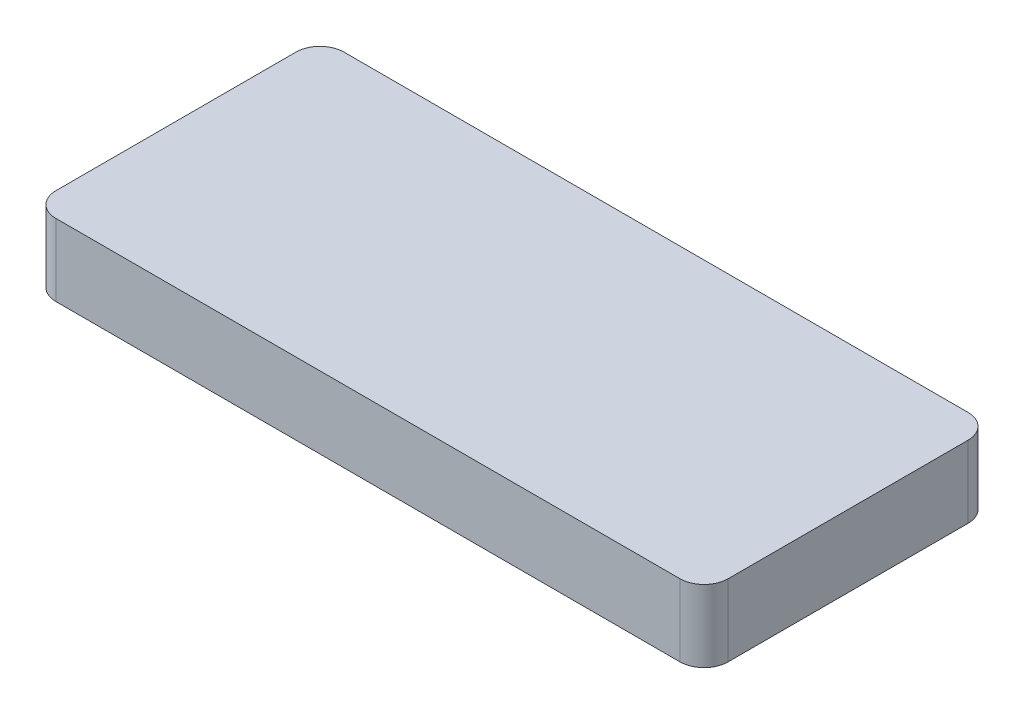
ISO-10303-21;
HEADER;
FILE_DESCRIPTION(('STEP AP214'),'2;1');
FILE_NAME('part.step','',(''),(''),'','','');
FILE_SCHEMA(('AUTOMOTIVE_DESIGN { 1 0 10303 214 1 1 1 1 }'));
ENDSEC;
DATA;
#1=APPLICATION_CONTEXT('core data for automotive mechanical design processes');
#2=APPLICATION_PROTOCOL_DEFINITION('international standard','automotive_design',2000,#1);
#3=PRODUCT_CONTEXT('',#1,'mechanical');
#4=PRODUCT('Part','Part','',(#3));
#5=PRODUCT_RELATED_PRODUCT_CATEGORY('part','',(#4));
#6=PRODUCT_DEFINITION_FORMATION('','',#4);
#7=PRODUCT_DEFINITION_CONTEXT('part definition',#1,'design');
#8=PRODUCT_DEFINITION('design','',#6,#7);
#9=PRODUCT_DEFINITION_SHAPE('','',#8);
#10=(LENGTH_UNIT() NAMED_UNIT(*) SI_UNIT(.MILLI.,.METRE.));
#11=(NAMED_UNIT(*) PLANE_ANGLE_UNIT() SI_UNIT($,.RADIAN.));
#12=(NAMED_UNIT(*) SI_UNIT($,.STERADIAN.) SOLID_ANGLE_UNIT());
#13=UNCERTAINTY_MEASURE_WITH_UNIT(LENGTH_MEASURE(1.E-05),#10,'distance_accuracy_value','');
#14=(GEOMETRIC_REPRESENTATION_CONTEXT(3) GLOBAL_UNCERTAINTY_ASSIGNED_CONTEXT((#13)) GLOBAL_UNIT_ASSIGNED_CONTEXT((#10,
#11,#12)) REPRESENTATION_CONTEXT('',''));
#15=CARTESIAN_POINT('',(0.,0.,0.));
#16=DIRECTION('',(0.,0.,1.));
#17=DIRECTION('',(1.,0.,0.));
#18=AXIS2_PLACEMENT_3D('',#15,#16,#17);
#19=CARTESIAN_POINT('',(70.,15.,30.));
#20=DIRECTION('',(-1.,0.,0.));
#21=DIRECTION('',(0.,0.,1.));
#22=AXIS2_PLACEMENT_3D('',#19,#20,#21);
#23=PLANE('',#22);
#24=DIRECTION('',(0.,0.,-1.));
#25=VECTOR('',#24,1.);
#26=CARTESIAN_POINT('',(70.,0.,30.));
#27=LINE('',#26,#25);
#28=CARTESIAN_POINT('',(70.,0.,25.));
#29=VERTEX_POINT('',#28);
#30=CARTESIAN_POINT('',(70.,0.,-25.));
#31=VERTEX_POINT('',#30);
#32=EDGE_CURVE('E132',#29,#31,#27,.T.);
#33=ORIENTED_EDGE('',*,*,#32,.T.);
#34=DIRECTION('',(0.,-1.,0.));
#35=VECTOR('',#34,1.);
#36=CARTESIAN_POINT('',(70.,15.,-25.));
#37=LINE('',#36,#35);
#38=CARTESIAN_POINT('',(70.,15.,-25.));
#39=VERTEX_POINT('',#38);
#40=EDGE_CURVE('E110',#31,#39,#37,.F.);
#41=ORIENTED_EDGE('',*,*,#40,.T.);
#42=DIRECTION('',(0.,0.,-1.));
#43=VECTOR('',#42,1.);
#44=CARTESIAN_POINT('',(70.,15.,30.));
#45=LINE('',#44,#43);
#46=CARTESIAN_POINT('',(70.,15.,25.));
#47=VERTEX_POINT('',#46);
#48=EDGE_CURVE('E141',#47,#39,#45,.T.);
#49=ORIENTED_EDGE('',*,*,#48,.F.);
#50=DIRECTION('',(0.,-1.,0.));
#51=VECTOR('',#50,1.);
#52=CARTESIAN_POINT('',(70.,15.,25.));
#53=LINE('',#52,#51);
#54=EDGE_CURVE('E115',#47,#29,#53,.T.);
#55=ORIENTED_EDGE('',*,*,#54,.T.);
#56=EDGE_LOOP('',(#33,#41,#49,#55));
#57=FACE_BOUND('',#56,.T.);
#58=ADVANCED_FACE('F39',(#57),#23,.F.);
#59=CARTESIAN_POINT('',(-70.,15.,-30.));
#60=DIRECTION('',(0.,0.,1.));
#61=DIRECTION('',(1.,0.,0.));
#62=AXIS2_PLACEMENT_3D('',#59,#60,#61);
#63=PLANE('',#62);
#64=DIRECTION('',(-1.,0.,0.));
#65=VECTOR('',#64,1.);
#66=CARTESIAN_POINT('',(-70.,15.,-30.));
#67=LINE('',#66,#65);
#68=CARTESIAN_POINT('',(65.,15.,-30.));
#69=VERTEX_POINT('',#68);
#70=CARTESIAN_POINT('',(-65.,15.,-30.));
#71=VERTEX_POINT('',#70);
#72=EDGE_CURVE('E125',#69,#71,#67,.T.);
#73=ORIENTED_EDGE('',*,*,#72,.F.);
#74=DIRECTION('',(0.,-1.,0.));
#75=VECTOR('',#74,1.);
#76=CARTESIAN_POINT('',(65.,15.,-30.));
#77=LINE('',#76,#75);
#78=CARTESIAN_POINT('',(65.,0.,-30.));
#79=VERTEX_POINT('',#78);
#80=EDGE_CURVE('E109',#69,#79,#77,.T.);
#81=ORIENTED_EDGE('',*,*,#80,.T.);
#82=DIRECTION('',(-1.,0.,0.));
#83=VECTOR('',#82,1.);
#84=CARTESIAN_POINT('',(-70.,0.,-30.));
#85=LINE('',#84,#83);
#86=CARTESIAN_POINT('',(-65.,0.,-30.));
#87=VERTEX_POINT('',#86);
#88=EDGE_CURVE('E122',#79,#87,#85,.T.);
#89=ORIENTED_EDGE('',*,*,#88,.T.);
#90=DIRECTION('',(0.,-1.,0.));
#91=VECTOR('',#90,1.);
#92=CARTESIAN_POINT('',(-65.,15.,-30.));
#93=LINE('',#92,#91);
#94=EDGE_CURVE('E127',#87,#71,#93,.F.);
#95=ORIENTED_EDGE('',*,*,#94,.T.);
#96=EDGE_LOOP('',(#73,#81,#89,#95));
#97=FACE_BOUND('',#96,.T.);
#98=ADVANCED_FACE('F121',(#97),#63,.F.);
#99=CARTESIAN_POINT('',(-70.,15.,30.));
#100=DIRECTION('',(1.,0.,0.));
#101=DIRECTION('',(0.,0.,-1.));
#102=AXIS2_PLACEMENT_3D('',#99,#100,#101);
#103=PLANE('',#102);
#104=DIRECTION('',(0.,0.,1.));
#105=VECTOR('',#104,1.);
#106=CARTESIAN_POINT('',(-70.,0.,30.));
#107=LINE('',#106,#105);
#108=CARTESIAN_POINT('',(-70.,0.,-25.));
#109=VERTEX_POINT('',#108);
#110=CARTESIAN_POINT('',(-70.,0.,25.));
#111=VERTEX_POINT('',#110);
#112=EDGE_CURVE('E131',#109,#111,#107,.T.);
#113=ORIENTED_EDGE('',*,*,#112,.T.);
#114=DIRECTION('',(0.,-1.,0.));
#115=VECTOR('',#114,1.);
#116=CARTESIAN_POINT('',(-70.,15.,25.));
#117=LINE('',#116,#115);
#118=CARTESIAN_POINT('',(-70.,15.,25.));
#119=VERTEX_POINT('',#118);
#120=EDGE_CURVE('E11',#111,#119,#117,.F.);
#121=ORIENTED_EDGE('',*,*,#120,.T.);
#122=DIRECTION('',(0.,0.,1.));
#123=VECTOR('',#122,1.);
#124=CARTESIAN_POINT('',(-70.,15.,30.));
#125=LINE('',#124,#123);
#126=CARTESIAN_POINT('',(-70.,15.,-25.));
#127=VERTEX_POINT('',#126);
#128=EDGE_CURVE('E167',#127,#119,#125,.T.);
#129=ORIENTED_EDGE('',*,*,#128,.F.);
#130=DIRECTION('',(0.,-1.,0.));
#131=VECTOR('',#130,1.);
#132=CARTESIAN_POINT('',(-70.,15.,-25.));
#133=LINE('',#132,#131);
#134=EDGE_CURVE('E47',#127,#109,#133,.T.);
#135=ORIENTED_EDGE('',*,*,#134,.T.);
#136=EDGE_LOOP('',(#113,#121,#129,#135));
#137=FACE_BOUND('',#136,.T.);
#138=ADVANCED_FACE('F165',(#137),#103,.F.);
#139=CARTESIAN_POINT('',(-70.,15.,30.));
#140=DIRECTION('',(0.,0.,-1.));
#141=DIRECTION('',(-1.,0.,0.));
#142=AXIS2_PLACEMENT_3D('',#139,#140,#141);
#143=PLANE('',#142);
#144=DIRECTION('',(1.,0.,0.));
#145=VECTOR('',#144,1.);
#146=CARTESIAN_POINT('',(-70.,0.,30.));
#147=LINE('',#146,#145);
#148=CARTESIAN_POINT('',(-65.,0.,30.));
#149=VERTEX_POINT('',#148);
#150=CARTESIAN_POINT('',(65.,0.,30.));
#151=VERTEX_POINT('',#150);
#152=EDGE_CURVE('E135',#149,#151,#147,.T.);
#153=ORIENTED_EDGE('',*,*,#152,.T.);
#154=DIRECTION('',(0.,-1.,0.));
#155=VECTOR('',#154,1.);
#156=CARTESIAN_POINT('',(65.,15.,30.));
#157=LINE('',#156,#155);
#158=CARTESIAN_POINT('',(65.,15.,30.));
#159=VERTEX_POINT('',#158);
#160=EDGE_CURVE('E54',#151,#159,#157,.F.);
#161=ORIENTED_EDGE('',*,*,#160,.T.);
#162=DIRECTION('',(1.,0.,0.));
#163=VECTOR('',#162,1.);
#164=CARTESIAN_POINT('',(-70.,15.,30.));
#165=LINE('',#164,#163);
#166=CARTESIAN_POINT('',(-65.,15.,30.));
#167=VERTEX_POINT('',#166);
#168=EDGE_CURVE('E142',#167,#159,#165,.T.);
#169=ORIENTED_EDGE('',*,*,#168,.F.);
#170=DIRECTION('',(0.,-1.,0.));
#171=VECTOR('',#170,1.);
#172=CARTESIAN_POINT('',(-65.,15.,30.));
#173=LINE('',#172,#171);
#174=EDGE_CURVE('E158',#167,#149,#173,.T.);
#175=ORIENTED_EDGE('',*,*,#174,.T.);
#176=EDGE_LOOP('',(#153,#161,#169,#175));
#177=FACE_BOUND('',#176,.T.);
#178=ADVANCED_FACE('F174',(#177),#143,.F.);
#179=CARTESIAN_POINT('',(0.,15.,0.));
#180=DIRECTION('',(0.,-1.,0.));
#181=DIRECTION('',(0.,0.,-1.));
#182=AXIS2_PLACEMENT_3D('',#179,#180,#181);
#183=PLANE('',#182);
#184=ORIENTED_EDGE('',*,*,#48,.T.);
#185=CARTESIAN_POINT('',(65.,15.,-25.));
#186=DIRECTION('',(0.,-1.,0.));
#187=DIRECTION('',(0.,0.,-1.));
#188=AXIS2_PLACEMENT_3D('',#185,#186,#187);
#189=CIRCLE('',#188,5.);
#190=EDGE_CURVE('E156',#39,#69,#189,.F.);
#191=ORIENTED_EDGE('',*,*,#190,.T.);
#192=ORIENTED_EDGE('',*,*,#72,.T.);
#193=CARTESIAN_POINT('',(-65.,15.,-25.));
#194=DIRECTION('',(0.,-1.,0.));
#195=DIRECTION('',(0.,0.,-1.));
#196=AXIS2_PLACEMENT_3D('',#193,#194,#195);
#197=CIRCLE('',#196,5.);
#198=EDGE_CURVE('E151',#71,#127,#197,.F.);
#199=ORIENTED_EDGE('',*,*,#198,.T.);
#200=ORIENTED_EDGE('',*,*,#128,.T.);
#201=CARTESIAN_POINT('',(-65.,15.,25.));
#202=DIRECTION('',(0.,-1.,0.));
#203=DIRECTION('',(0.,0.,-1.));
#204=AXIS2_PLACEMENT_3D('',#201,#202,#203);
#205=CIRCLE('',#204,5.);
#206=EDGE_CURVE('E61',#119,#167,#205,.F.);
#207=ORIENTED_EDGE('',*,*,#206,.T.);
#208=ORIENTED_EDGE('',*,*,#168,.T.);
#209=CARTESIAN_POINT('',(65.,15.,25.));
#210=DIRECTION('',(0.,-1.,0.));
#211=DIRECTION('',(0.,0.,-1.));
#212=AXIS2_PLACEMENT_3D('',#209,#210,#211);
#213=CIRCLE('',#212,5.);
#214=EDGE_CURVE('E154',#159,#47,#213,.F.);
#215=ORIENTED_EDGE('',*,*,#214,.T.);
#216=EDGE_LOOP('',(#184,#191,#192,#199,#200,#207,#208,#215));
#217=FACE_BOUND('',#216,.T.);
#218=ADVANCED_FACE('F181',(#217),#183,.F.);
#219=CARTESIAN_POINT('',(0.,0.,0.));
#220=DIRECTION('',(0.,-1.,0.));
#221=DIRECTION('',(0.,0.,-1.));
#222=AXIS2_PLACEMENT_3D('',#219,#220,#221);
#223=PLANE('',#222);
#224=ORIENTED_EDGE('',*,*,#88,.F.);
#225=CARTESIAN_POINT('',(65.,0.,-25.));
#226=DIRECTION('',(0.,-1.,0.));
#227=DIRECTION('',(0.,0.,-1.));
#228=AXIS2_PLACEMENT_3D('',#225,#226,#227);
#229=CIRCLE('',#228,5.);
#230=EDGE_CURVE('E105',#79,#31,#229,.T.);
#231=ORIENTED_EDGE('',*,*,#230,.T.);
#232=ORIENTED_EDGE('',*,*,#32,.F.);
#233=CARTESIAN_POINT('',(65.,0.,25.));
#234=DIRECTION('',(0.,-1.,0.));
#235=DIRECTION('',(0.,0.,-1.));
#236=AXIS2_PLACEMENT_3D('',#233,#234,#235);
#237=CIRCLE('',#236,5.);
#238=EDGE_CURVE('E116',#29,#151,#237,.T.);
#239=ORIENTED_EDGE('',*,*,#238,.T.);
#240=ORIENTED_EDGE('',*,*,#152,.F.);
#241=CARTESIAN_POINT('',(-65.,0.,25.));
#242=DIRECTION('',(0.,-1.,0.));
#243=DIRECTION('',(0.,0.,-1.));
#244=AXIS2_PLACEMENT_3D('',#241,#242,#243);
#245=CIRCLE('',#244,5.);
#246=EDGE_CURVE('E145',#149,#111,#245,.T.);
#247=ORIENTED_EDGE('',*,*,#246,.T.);
#248=ORIENTED_EDGE('',*,*,#112,.F.);
#249=CARTESIAN_POINT('',(-65.,0.,-25.));
#250=DIRECTION('',(0.,-1.,0.));
#251=DIRECTION('',(0.,0.,-1.));
#252=AXIS2_PLACEMENT_3D('',#249,#250,#251);
#253=CIRCLE('',#252,5.);
#254=EDGE_CURVE('E126',#109,#87,#253,.T.);
#255=ORIENTED_EDGE('',*,*,#254,.T.);
#256=EDGE_LOOP('',(#224,#231,#232,#239,#240,#247,#248,#255));
#257=FACE_BOUND('',#256,.T.);
#258=ADVANCED_FACE('F129',(#257),#223,.T.);
#259=CARTESIAN_POINT('',(65.,15.,-25.));
#260=DIRECTION('',(0.,-1.,0.));
#261=DIRECTION('',(0.,0.,-1.));
#262=AXIS2_PLACEMENT_3D('',#259,#260,#261);
#263=CYLINDRICAL_SURFACE('',#262,5.);
#264=ORIENTED_EDGE('',*,*,#190,.F.);
#265=ORIENTED_EDGE('',*,*,#40,.F.);
#266=ORIENTED_EDGE('',*,*,#230,.F.);
#267=ORIENTED_EDGE('',*,*,#80,.F.);
#268=EDGE_LOOP('',(#264,#265,#266,#267));
#269=FACE_BOUND('',#268,.T.);
#270=ADVANCED_FACE('F108',(#269),#263,.T.);
#271=CARTESIAN_POINT('',(65.,15.,25.));
#272=DIRECTION('',(0.,-1.,0.));
#273=DIRECTION('',(0.,0.,-1.));
#274=AXIS2_PLACEMENT_3D('',#271,#272,#273);
#275=CYLINDRICAL_SURFACE('',#274,5.);
#276=ORIENTED_EDGE('',*,*,#214,.F.);
#277=ORIENTED_EDGE('',*,*,#160,.F.);
#278=ORIENTED_EDGE('',*,*,#238,.F.);
#279=ORIENTED_EDGE('',*,*,#54,.F.);
#280=EDGE_LOOP('',(#276,#277,#278,#279));
#281=FACE_BOUND('',#280,.T.);
#282=ADVANCED_FACE('F185',(#281),#275,.T.);
#283=CARTESIAN_POINT('',(-65.,15.,25.));
#284=DIRECTION('',(0.,-1.,0.));
#285=DIRECTION('',(0.,0.,-1.));
#286=AXIS2_PLACEMENT_3D('',#283,#284,#285);
#287=CYLINDRICAL_SURFACE('',#286,5.);
#288=ORIENTED_EDGE('',*,*,#206,.F.);
#289=ORIENTED_EDGE('',*,*,#120,.F.);
#290=ORIENTED_EDGE('',*,*,#246,.F.);
#291=ORIENTED_EDGE('',*,*,#174,.F.);
#292=EDGE_LOOP('',(#288,#289,#290,#291));
#293=FACE_BOUND('',#292,.T.);
#294=ADVANCED_FACE('F173',(#293),#287,.T.);
#295=CARTESIAN_POINT('',(-65.,15.,-25.));
#296=DIRECTION('',(0.,-1.,0.));
#297=DIRECTION('',(0.,0.,-1.));
#298=AXIS2_PLACEMENT_3D('',#295,#296,#297);
#299=CYLINDRICAL_SURFACE('',#298,5.);
#300=ORIENTED_EDGE('',*,*,#198,.F.);
#301=ORIENTED_EDGE('',*,*,#94,.F.);
#302=ORIENTED_EDGE('',*,*,#254,.F.);
#303=ORIENTED_EDGE('',*,*,#134,.F.);
#304=EDGE_LOOP('',(#300,#301,#302,#303));
#305=FACE_BOUND('',#304,.T.);
#306=ADVANCED_FACE('F41',(#305),#299,.T.);
#307=CLOSED_SHELL('',(#58,#98,#138,#178,#218,#258,#270,#282,#294,#306));
#308=MANIFOLD_SOLID_BREP('B2',#307);
#309=ADVANCED_BREP_SHAPE_REPRESENTATION('',(#18,#308),#14);
#310=SHAPE_DEFINITION_REPRESENTATION(#9,#309);
ENDSEC;
END-ISO-10303-21;
